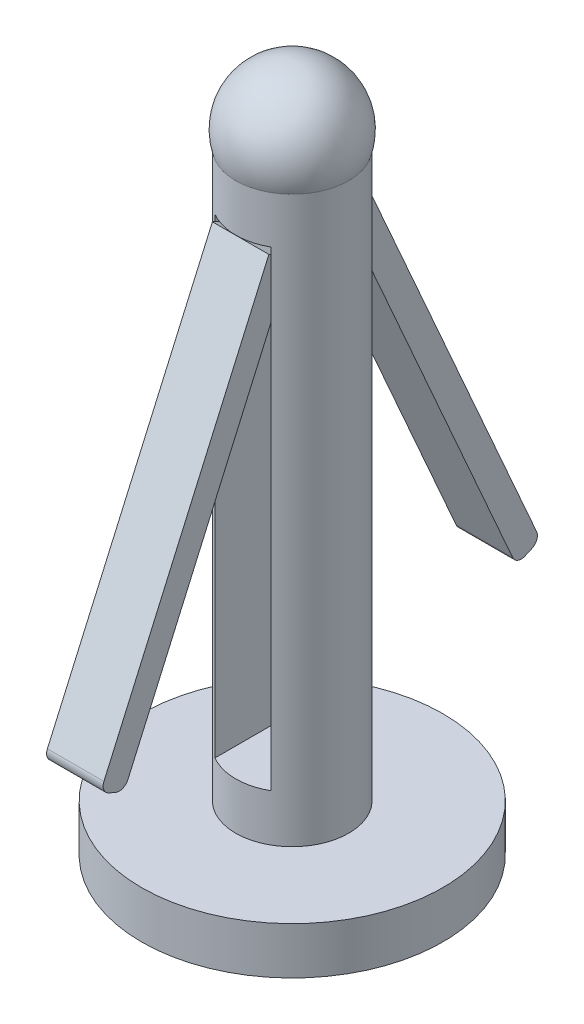
ISO-10303-21;
HEADER;
FILE_DESCRIPTION(('STEP AP214'),'2;1');
FILE_NAME('part.step','',(''),(''),'','','');
FILE_SCHEMA(('AUTOMOTIVE_DESIGN { 1 0 10303 214 1 1 1 1 }'));
ENDSEC;
DATA;
#1=APPLICATION_CONTEXT('core data for automotive mechanical design processes');
#2=APPLICATION_PROTOCOL_DEFINITION('international standard','automotive_design',2000,#1);
#3=PRODUCT_CONTEXT('',#1,'mechanical');
#4=PRODUCT('Part','Part','',(#3));
#5=PRODUCT_RELATED_PRODUCT_CATEGORY('part','',(#4));
#6=PRODUCT_DEFINITION_FORMATION('','',#4);
#7=PRODUCT_DEFINITION_CONTEXT('part definition',#1,'design');
#8=PRODUCT_DEFINITION('design','',#6,#7);
#9=PRODUCT_DEFINITION_SHAPE('','',#8);
#10=(LENGTH_UNIT() NAMED_UNIT(*) SI_UNIT(.MILLI.,.METRE.));
#11=(NAMED_UNIT(*) PLANE_ANGLE_UNIT() SI_UNIT($,.RADIAN.));
#12=(NAMED_UNIT(*) SI_UNIT($,.STERADIAN.) SOLID_ANGLE_UNIT());
#13=UNCERTAINTY_MEASURE_WITH_UNIT(LENGTH_MEASURE(1.E-05),#10,'distance_accuracy_value','');
#14=(GEOMETRIC_REPRESENTATION_CONTEXT(3) GLOBAL_UNCERTAINTY_ASSIGNED_CONTEXT((#13)) GLOBAL_UNIT_ASSIGNED_CONTEXT((#10,
#11,#12)) REPRESENTATION_CONTEXT('',''));
#15=CARTESIAN_POINT('',(0.,0.,0.));
#16=DIRECTION('',(0.,0.,1.));
#17=DIRECTION('',(1.,0.,0.));
#18=AXIS2_PLACEMENT_3D('',#15,#16,#17);
#19=CARTESIAN_POINT('',(-3.0237591290621,14.0271805623324,-21.346207791417));
#20=DIRECTION('',(1.,0.,0.));
#21=DIRECTION('',(0.,1.,0.));
#22=AXIS2_PLACEMENT_3D('',#19,#20,#21);
#23=CYLINDRICAL_SURFACE('',#22,1.);
#24=DIRECTION('',(1.,0.,0.));
#25=VECTOR('',#24,1.);
#26=CARTESIAN_POINT('',(-3.0237591290621,13.6235064220948,-20.4313049613288));
#27=LINE('',#26,#25);
#28=CARTESIAN_POINT('',(-3.0237591290621,13.6235064220948,-20.4313049613288));
#29=VERTEX_POINT('',#28);
#30=CARTESIAN_POINT('',(2.9762408709379,13.6235064220948,-20.4313049613288));
#31=VERTEX_POINT('',#30);
#32=EDGE_CURVE('E324',#29,#31,#27,.T.);
#33=ORIENTED_EDGE('',*,*,#32,.F.);
#34=CARTESIAN_POINT('',(-3.0237591290621,14.0271805623324,-21.346207791417));
#35=DIRECTION('',(1.,0.,0.));
#36=DIRECTION('',(0.,1.,0.));
#37=AXIS2_PLACEMENT_3D('',#34,#35,#36);
#38=CIRCLE('',#37,1.);
#39=CARTESIAN_POINT('',(-3.0237591290621,13.1122777322441,-21.7498819316545));
#40=VERTEX_POINT('',#39);
#41=EDGE_CURVE('E39',#40,#29,#38,.F.);
#42=ORIENTED_EDGE('',*,*,#41,.F.);
#43=DIRECTION('',(1.,0.,0.));
#44=VECTOR('',#43,1.);
#45=CARTESIAN_POINT('',(-3.0237591290621,13.1122777322441,-21.7498819316545));
#46=LINE('',#45,#44);
#47=CARTESIAN_POINT('',(2.9762408709379,13.1122777322441,-21.7498819316545));
#48=VERTEX_POINT('',#47);
#49=EDGE_CURVE('E327',#48,#40,#46,.F.);
#50=ORIENTED_EDGE('',*,*,#49,.F.);
#51=CARTESIAN_POINT('',(2.9762408709379,14.0271805623324,-21.346207791417));
#52=DIRECTION('',(1.,0.,0.));
#53=DIRECTION('',(0.,1.,0.));
#54=AXIS2_PLACEMENT_3D('',#51,#52,#53);
#55=CIRCLE('',#54,1.);
#56=EDGE_CURVE('E11',#31,#48,#55,.T.);
#57=ORIENTED_EDGE('',*,*,#56,.F.);
#58=EDGE_LOOP('',(#33,#42,#50,#57));
#59=FACE_BOUND('',#58,.T.);
#60=ADVANCED_FACE('F32',(#59),#23,.T.);
#61=CARTESIAN_POINT('',(-3.0237591290621,14.3406013358795,-22.0565568679222));
#62=DIRECTION('',(-1.,0.,0.));
#63=DIRECTION('',(0.,-1.,0.));
#64=AXIS2_PLACEMENT_3D('',#61,#62,#63);
#65=CYLINDRICAL_SURFACE('',#64,1.);
#66=DIRECTION('',(-1.,0.,0.));
#67=VECTOR('',#66,1.);
#68=CARTESIAN_POINT('',(-3.0237591290621,14.7442754761171,-22.9714596980105));
#69=LINE('',#68,#67);
#70=CARTESIAN_POINT('',(2.9762408709379,14.7442754761171,-22.9714596980105));
#71=VERTEX_POINT('',#70);
#72=CARTESIAN_POINT('',(-3.0237591290621,14.7442754761171,-22.9714596980105));
#73=VERTEX_POINT('',#72);
#74=EDGE_CURVE('E313',#71,#73,#69,.T.);
#75=ORIENTED_EDGE('',*,*,#74,.F.);
#76=CARTESIAN_POINT('',(2.9762408709379,14.3406013358795,-22.0565568679222));
#77=DIRECTION('',(1.,0.,0.));
#78=DIRECTION('',(0.,1.,0.));
#79=AXIS2_PLACEMENT_3D('',#76,#77,#78);
#80=CIRCLE('',#79,1.);
#81=CARTESIAN_POINT('',(2.9762408709379,13.4256985057913,-22.4602310081598));
#82=VERTEX_POINT('',#81);
#83=EDGE_CURVE('E319',#82,#71,#80,.T.);
#84=ORIENTED_EDGE('',*,*,#83,.F.);
#85=DIRECTION('',(-1.,0.,0.));
#86=VECTOR('',#85,1.);
#87=CARTESIAN_POINT('',(-3.0237591290621,13.4256985057913,-22.4602310081598));
#88=LINE('',#87,#86);
#89=CARTESIAN_POINT('',(-3.0237591290621,13.4256985057913,-22.4602310081598));
#90=VERTEX_POINT('',#89);
#91=EDGE_CURVE('E316',#90,#82,#88,.F.);
#92=ORIENTED_EDGE('',*,*,#91,.F.);
#93=CARTESIAN_POINT('',(-3.0237591290621,14.3406013358795,-22.0565568679222));
#94=DIRECTION('',(1.,0.,0.));
#95=DIRECTION('',(0.,1.,0.));
#96=AXIS2_PLACEMENT_3D('',#93,#94,#95);
#97=CIRCLE('',#96,1.);
#98=EDGE_CURVE('E321',#73,#90,#97,.F.);
#99=ORIENTED_EDGE('',*,*,#98,.F.);
#100=EDGE_LOOP('',(#75,#84,#92,#99));
#101=FACE_BOUND('',#100,.T.);
#102=ADVANCED_FACE('F402',(#101),#65,.T.);
#103=CARTESIAN_POINT('',(-3.0237591290621,14.0271805623324,21.346207791417));
#104=DIRECTION('',(-1.,0.,0.));
#105=DIRECTION('',(0.,-1.,0.));
#106=AXIS2_PLACEMENT_3D('',#103,#104,#105);
#107=CYLINDRICAL_SURFACE('',#106,1.);
#108=DIRECTION('',(-1.,0.,0.));
#109=VECTOR('',#108,1.);
#110=CARTESIAN_POINT('',(-3.0237591290621,13.6235064220948,20.4313049613288));
#111=LINE('',#110,#109);
#112=CARTESIAN_POINT('',(2.9762408709379,13.6235064220948,20.4313049613288));
#113=VERTEX_POINT('',#112);
#114=CARTESIAN_POINT('',(-3.0237591290621,13.6235064220948,20.4313049613288));
#115=VERTEX_POINT('',#114);
#116=EDGE_CURVE('E303',#113,#115,#111,.T.);
#117=ORIENTED_EDGE('',*,*,#116,.F.);
#118=CARTESIAN_POINT('',(2.9762408709379,14.0271805623324,21.346207791417));
#119=DIRECTION('',(1.,0.,0.));
#120=DIRECTION('',(0.,1.,0.));
#121=AXIS2_PLACEMENT_3D('',#118,#119,#120);
#122=CIRCLE('',#121,1.);
#123=CARTESIAN_POINT('',(2.9762408709379,13.1122777322441,21.7498819316545));
#124=VERTEX_POINT('',#123);
#125=EDGE_CURVE('E309',#124,#113,#122,.T.);
#126=ORIENTED_EDGE('',*,*,#125,.F.);
#127=DIRECTION('',(-1.,0.,0.));
#128=VECTOR('',#127,1.);
#129=CARTESIAN_POINT('',(-3.0237591290621,13.1122777322441,21.7498819316545));
#130=LINE('',#129,#128);
#131=CARTESIAN_POINT('',(-3.0237591290621,13.1122777322441,21.7498819316545));
#132=VERTEX_POINT('',#131);
#133=EDGE_CURVE('E306',#132,#124,#130,.F.);
#134=ORIENTED_EDGE('',*,*,#133,.F.);
#135=CARTESIAN_POINT('',(-3.0237591290621,14.0271805623324,21.346207791417));
#136=DIRECTION('',(1.,0.,0.));
#137=DIRECTION('',(0.,1.,0.));
#138=AXIS2_PLACEMENT_3D('',#135,#136,#137);
#139=CIRCLE('',#138,1.);
#140=EDGE_CURVE('E311',#115,#132,#139,.F.);
#141=ORIENTED_EDGE('',*,*,#140,.F.);
#142=EDGE_LOOP('',(#117,#126,#134,#141));
#143=FACE_BOUND('',#142,.T.);
#144=ADVANCED_FACE('F377',(#143),#107,.T.);
#145=CARTESIAN_POINT('',(-3.0237591290621,14.3406013358795,22.0565568679222));
#146=DIRECTION('',(1.,0.,0.));
#147=DIRECTION('',(0.,1.,0.));
#148=AXIS2_PLACEMENT_3D('',#145,#146,#147);
#149=CYLINDRICAL_SURFACE('',#148,1.);
#150=DIRECTION('',(1.,0.,0.));
#151=VECTOR('',#150,1.);
#152=CARTESIAN_POINT('',(-3.0237591290621,14.7442754761171,22.9714596980105));
#153=LINE('',#152,#151);
#154=CARTESIAN_POINT('',(-3.0237591290621,14.7442754761171,22.9714596980105));
#155=VERTEX_POINT('',#154);
#156=CARTESIAN_POINT('',(2.9762408709379,14.7442754761171,22.9714596980105));
#157=VERTEX_POINT('',#156);
#158=EDGE_CURVE('E292',#155,#157,#153,.T.);
#159=ORIENTED_EDGE('',*,*,#158,.F.);
#160=CARTESIAN_POINT('',(-3.0237591290621,14.3406013358795,22.0565568679222));
#161=DIRECTION('',(1.,0.,0.));
#162=DIRECTION('',(0.,1.,0.));
#163=AXIS2_PLACEMENT_3D('',#160,#161,#162);
#164=CIRCLE('',#163,1.);
#165=CARTESIAN_POINT('',(-3.0237591290621,13.4256985057913,22.4602310081598));
#166=VERTEX_POINT('',#165);
#167=EDGE_CURVE('E298',#166,#155,#164,.F.);
#168=ORIENTED_EDGE('',*,*,#167,.F.);
#169=DIRECTION('',(1.,0.,0.));
#170=VECTOR('',#169,1.);
#171=CARTESIAN_POINT('',(-3.0237591290621,13.4256985057913,22.4602310081598));
#172=LINE('',#171,#170);
#173=CARTESIAN_POINT('',(2.9762408709379,13.4256985057913,22.4602310081598));
#174=VERTEX_POINT('',#173);
#175=EDGE_CURVE('E295',#174,#166,#172,.F.);
#176=ORIENTED_EDGE('',*,*,#175,.F.);
#177=CARTESIAN_POINT('',(2.9762408709379,14.3406013358795,22.0565568679222));
#178=DIRECTION('',(1.,0.,0.));
#179=DIRECTION('',(0.,1.,0.));
#180=AXIS2_PLACEMENT_3D('',#177,#178,#179);
#181=CIRCLE('',#180,1.);
#182=EDGE_CURVE('E300',#157,#174,#181,.T.);
#183=ORIENTED_EDGE('',*,*,#182,.F.);
#184=EDGE_LOOP('',(#159,#168,#176,#183));
#185=FACE_BOUND('',#184,.T.);
#186=ADVANCED_FACE('F370',(#185),#149,.T.);
#187=CARTESIAN_POINT('',(-3.0237591290621,55.,-6.));
#188=DIRECTION('',(-1.,0.,0.));
#189=DIRECTION('',(0.,-1.,0.));
#190=AXIS2_PLACEMENT_3D('',#187,#188,#189);
#191=PLANE('',#190);
#192=DIRECTION('',(0.,-1.,0.));
#193=VECTOR('',#192,1.);
#194=CARTESIAN_POINT('',(-3.0237591290621,60.,-5.18236246603936));
#195=LINE('',#194,#193);
#196=CARTESIAN_POINT('',(-3.0237591290621,48.1843049824975,-5.18236246603936));
#197=VERTEX_POINT('',#196);
#198=CARTESIAN_POINT('',(-3.0237591290621,5.,-5.18236246603937));
#199=VERTEX_POINT('',#198);
#200=EDGE_CURVE('E194',#197,#199,#195,.T.);
#201=ORIENTED_EDGE('',*,*,#200,.F.);
#202=DIRECTION('',(0.,-0.914902830088248,-0.403674140237536));
#203=VECTOR('',#202,1.);
#204=CARTESIAN_POINT('',(-3.0237591290621,12.7086035920066,-20.8349791015663));
#205=LINE('',#204,#203);
#206=CARTESIAN_POINT('',(-3.0237591290621,53.3243296930876,-2.91447675445292));
#207=VERTEX_POINT('',#206);
#208=EDGE_CURVE('E178',#207,#197,#205,.T.);
#209=ORIENTED_EDGE('',*,*,#208,.F.);
#210=DIRECTION('',(0.,-0.403674140237535,0.914902830088249));
#211=VECTOR('',#210,1.);
#212=CARTESIAN_POINT('',(-3.0237591290621,54.4450987471099,-5.45463149113464));
#213=LINE('',#212,#211);
#214=CARTESIAN_POINT('',(-3.0237591290621,54.3249679955108,-5.18236246603936));
#215=VERTEX_POINT('',#214);
#216=EDGE_CURVE('E165',#215,#207,#213,.T.);
#217=ORIENTED_EDGE('',*,*,#216,.F.);
#218=CARTESIAN_POINT('',(-3.0237591290621,55.,-5.18236246603936));
#219=VERTEX_POINT('',#218);
#220=EDGE_CURVE('E276',#219,#215,#195,.T.);
#221=ORIENTED_EDGE('',*,*,#220,.F.);
#222=DIRECTION('',(0.,0.,1.));
#223=VECTOR('',#222,1.);
#224=CARTESIAN_POINT('',(-3.0237591290621,55.,-6.));
#225=LINE('',#224,#223);
#226=CARTESIAN_POINT('',(-3.0237591290621,55.,5.18236246603936));
#227=VERTEX_POINT('',#226);
#228=EDGE_CURVE('E242',#219,#227,#225,.T.);
#229=ORIENTED_EDGE('',*,*,#228,.T.);
#230=DIRECTION('',(0.,-1.,0.));
#231=VECTOR('',#230,1.);
#232=CARTESIAN_POINT('',(-3.0237591290621,60.,5.18236246603936));
#233=LINE('',#232,#231);
#234=CARTESIAN_POINT('',(-3.0237591290621,54.3249679955108,5.18236246603937));
#235=VERTEX_POINT('',#234);
#236=EDGE_CURVE('E270',#235,#227,#233,.F.);
#237=ORIENTED_EDGE('',*,*,#236,.F.);
#238=DIRECTION('',(0.,-0.403674140237535,-0.914902830088249));
#239=VECTOR('',#238,1.);
#240=CARTESIAN_POINT('',(-3.0237591290621,54.4450987471099,5.45463149113464));
#241=LINE('',#240,#239);
#242=CARTESIAN_POINT('',(-3.0237591290621,53.3243296930876,2.91447675445292));
#243=VERTEX_POINT('',#242);
#244=EDGE_CURVE('E219',#235,#243,#241,.T.);
#245=ORIENTED_EDGE('',*,*,#244,.T.);
#246=DIRECTION('',(0.,-0.914902830088248,0.403674140237536));
#247=VECTOR('',#246,1.);
#248=CARTESIAN_POINT('',(-3.0237591290621,12.7086035920066,20.8349791015663));
#249=LINE('',#248,#247);
#250=CARTESIAN_POINT('',(-3.0237591290621,48.1843049824975,5.18236246603936));
#251=VERTEX_POINT('',#250);
#252=EDGE_CURVE('E224',#243,#251,#249,.T.);
#253=ORIENTED_EDGE('',*,*,#252,.T.);
#254=CARTESIAN_POINT('',(-3.0237591290621,5.,5.18236246603937));
#255=VERTEX_POINT('',#254);
#256=EDGE_CURVE('E272',#255,#251,#233,.F.);
#257=ORIENTED_EDGE('',*,*,#256,.F.);
#258=DIRECTION('',(0.,0.,1.));
#259=VECTOR('',#258,1.);
#260=CARTESIAN_POINT('',(-3.0237591290621,5.,-6.));
#261=LINE('',#260,#259);
#262=EDGE_CURVE('E241',#199,#255,#261,.T.);
#263=ORIENTED_EDGE('',*,*,#262,.F.);
#264=EDGE_LOOP('',(#201,#209,#217,#221,#229,#237,#245,#253,#257,#263));
#265=FACE_BOUND('',#264,.T.);
#266=ADVANCED_FACE('F192',(#265),#191,.F.);
#267=CARTESIAN_POINT('',(2.9762408709379,55.,-6.));
#268=DIRECTION('',(1.,0.,0.));
#269=DIRECTION('',(0.,1.,0.));
#270=AXIS2_PLACEMENT_3D('',#267,#268,#269);
#271=PLANE('',#270);
#272=DIRECTION('',(0.,-0.403674140237535,0.914902830088249));
#273=VECTOR('',#272,1.);
#274=CARTESIAN_POINT('',(2.9762408709379,54.4450987471099,-5.45463149113464));
#275=LINE('',#274,#273);
#276=CARTESIAN_POINT('',(2.9762408709379,54.3370729147514,-5.2097975275589));
#277=VERTEX_POINT('',#276);
#278=CARTESIAN_POINT('',(2.9762408709379,53.3243296930876,-2.91447675445292));
#279=VERTEX_POINT('',#278);
#280=EDGE_CURVE('E207',#277,#279,#275,.T.);
#281=ORIENTED_EDGE('',*,*,#280,.T.);
#282=DIRECTION('',(0.,-0.914902830088248,-0.403674140237536));
#283=VECTOR('',#282,1.);
#284=CARTESIAN_POINT('',(2.9762408709379,12.7086035920066,-20.8349791015663));
#285=LINE('',#284,#283);
#286=CARTESIAN_POINT('',(2.9762408709379,48.1221250880581,-5.20979752755891));
#287=VERTEX_POINT('',#286);
#288=EDGE_CURVE('E186',#279,#287,#285,.T.);
#289=ORIENTED_EDGE('',*,*,#288,.T.);
#290=DIRECTION('',(0.,-1.,0.));
#291=VECTOR('',#290,1.);
#292=CARTESIAN_POINT('',(2.9762408709379,60.,-5.2097975275589));
#293=LINE('',#292,#291);
#294=CARTESIAN_POINT('',(2.9762408709379,5.,-5.2097975275589));
#295=VERTEX_POINT('',#294);
#296=EDGE_CURVE('E285',#295,#287,#293,.F.);
#297=ORIENTED_EDGE('',*,*,#296,.F.);
#298=DIRECTION('',(0.,0.,1.));
#299=VECTOR('',#298,1.);
#300=CARTESIAN_POINT('',(2.9762408709379,5.,-6.));
#301=LINE('',#300,#299);
#302=CARTESIAN_POINT('',(2.9762408709379,5.,5.2097975275589));
#303=VERTEX_POINT('',#302);
#304=EDGE_CURVE('E249',#295,#303,#301,.T.);
#305=ORIENTED_EDGE('',*,*,#304,.T.);
#306=DIRECTION('',(0.,-1.,0.));
#307=VECTOR('',#306,1.);
#308=CARTESIAN_POINT('',(2.9762408709379,60.,5.2097975275589));
#309=LINE('',#308,#307);
#310=CARTESIAN_POINT('',(2.9762408709379,48.1221250880582,5.2097975275589));
#311=VERTEX_POINT('',#310);
#312=EDGE_CURVE('E278',#311,#303,#309,.T.);
#313=ORIENTED_EDGE('',*,*,#312,.F.);
#314=DIRECTION('',(0.,-0.914902830088248,0.403674140237536));
#315=VECTOR('',#314,1.);
#316=CARTESIAN_POINT('',(2.9762408709379,12.7086035920066,20.8349791015663));
#317=LINE('',#316,#315);
#318=CARTESIAN_POINT('',(2.9762408709379,53.3243296930876,2.91447675445292));
#319=VERTEX_POINT('',#318);
#320=EDGE_CURVE('E217',#319,#311,#317,.T.);
#321=ORIENTED_EDGE('',*,*,#320,.F.);
#322=DIRECTION('',(0.,-0.403674140237536,-0.914902830088249));
#323=VECTOR('',#322,1.);
#324=CARTESIAN_POINT('',(2.9762408709379,50.3050670292558,-3.92849801300188));
#325=LINE('',#324,#323);
#326=CARTESIAN_POINT('',(2.9762408709379,54.3370729147514,5.20979752755891));
#327=VERTEX_POINT('',#326);
#328=EDGE_CURVE('E288',#327,#319,#325,.T.);
#329=ORIENTED_EDGE('',*,*,#328,.F.);
#330=CARTESIAN_POINT('',(2.9762408709379,55.,5.2097975275589));
#331=VERTEX_POINT('',#330);
#332=EDGE_CURVE('E280',#331,#327,#309,.T.);
#333=ORIENTED_EDGE('',*,*,#332,.F.);
#334=DIRECTION('',(0.,0.,1.));
#335=VECTOR('',#334,1.);
#336=CARTESIAN_POINT('',(2.9762408709379,55.,-6.));
#337=LINE('',#336,#335);
#338=CARTESIAN_POINT('',(2.9762408709379,55.,-5.2097975275589));
#339=VERTEX_POINT('',#338);
#340=EDGE_CURVE('E246',#339,#331,#337,.T.);
#341=ORIENTED_EDGE('',*,*,#340,.F.);
#342=EDGE_CURVE('E283',#277,#339,#293,.F.);
#343=ORIENTED_EDGE('',*,*,#342,.F.);
#344=EDGE_LOOP('',(#281,#289,#297,#305,#313,#321,#329,#333,#341,#343));
#345=FACE_BOUND('',#344,.T.);
#346=ADVANCED_FACE('F346',(#345),#271,.F.);
#347=CARTESIAN_POINT('',(0.,0.,0.));
#348=DIRECTION('',(0.,1.,0.));
#349=DIRECTION('',(0.,0.,1.));
#350=AXIS2_PLACEMENT_3D('',#347,#348,#349);
#351=PLANE('',#350);
#352=CARTESIAN_POINT('',(0.,0.,0.));
#353=DIRECTION('',(0.,1.,0.));
#354=DIRECTION('',(0.,0.,1.));
#355=AXIS2_PLACEMENT_3D('',#352,#353,#354);
#356=CIRCLE('',#355,16.);
#357=CARTESIAN_POINT('',(0.,0.,16.));
#358=VERTEX_POINT('',#357);
#359=EDGE_CURVE('E260',#358,#358,#356,.T.);
#360=ORIENTED_EDGE('',*,*,#359,.T.);
#361=EDGE_LOOP('',(#360));
#362=FACE_BOUND('',#361,.T.);
#363=CARTESIAN_POINT('',(0.,0.,0.));
#364=DIRECTION('',(0.,1.,0.));
#365=DIRECTION('',(0.,0.,1.));
#366=AXIS2_PLACEMENT_3D('',#363,#364,#365);
#367=CIRCLE('',#366,6.);
#368=CARTESIAN_POINT('',(0.,0.,6.));
#369=VERTEX_POINT('',#368);
#370=EDGE_CURVE('E245',#369,#369,#367,.T.);
#371=ORIENTED_EDGE('',*,*,#370,.F.);
#372=EDGE_LOOP('',(#371));
#373=FACE_BOUND('',#372,.T.);
#374=ADVANCED_FACE('F434',(#362,#373),#351,.T.);
#375=CARTESIAN_POINT('',(0.,-5.,0.));
#376=DIRECTION('',(0.,1.,0.));
#377=DIRECTION('',(0.,0.,1.));
#378=AXIS2_PLACEMENT_3D('',#375,#376,#377);
#379=CYLINDRICAL_SURFACE('',#378,16.);
#380=CARTESIAN_POINT('',(0.,-5.,0.));
#381=DIRECTION('',(0.,1.,0.));
#382=DIRECTION('',(0.,0.,1.));
#383=AXIS2_PLACEMENT_3D('',#380,#381,#382);
#384=CIRCLE('',#383,16.);
#385=CARTESIAN_POINT('',(0.,-5.,16.));
#386=VERTEX_POINT('',#385);
#387=EDGE_CURVE('E256',#386,#386,#384,.T.);
#388=ORIENTED_EDGE('',*,*,#387,.T.);
#389=EDGE_LOOP('',(#388));
#390=FACE_BOUND('',#389,.T.);
#391=ORIENTED_EDGE('',*,*,#359,.F.);
#392=EDGE_LOOP('',(#391));
#393=FACE_BOUND('',#392,.T.);
#394=ADVANCED_FACE('F430',(#390,#393),#379,.T.);
#395=CARTESIAN_POINT('',(0.,-5.,0.));
#396=DIRECTION('',(0.,1.,0.));
#397=DIRECTION('',(0.,0.,1.));
#398=AXIS2_PLACEMENT_3D('',#395,#396,#397);
#399=PLANE('',#398);
#400=ORIENTED_EDGE('',*,*,#387,.F.);
#401=EDGE_LOOP('',(#400));
#402=FACE_BOUND('',#401,.T.);
#403=ADVANCED_FACE('F433',(#402),#399,.F.);
#404=CARTESIAN_POINT('',(0.,60.,0.));
#405=DIRECTION('',(0.,-1.,0.));
#406=DIRECTION('',(0.,0.,-1.));
#407=AXIS2_PLACEMENT_3D('',#404,#405,#406);
#408=CYLINDRICAL_SURFACE('',#407,6.);
#409=ORIENTED_EDGE('',*,*,#296,.T.);
#410=EDGE_CURVE('E289',#287,#277,#293,.F.);
#411=ORIENTED_EDGE('',*,*,#410,.T.);
#412=ORIENTED_EDGE('',*,*,#342,.T.);
#413=CARTESIAN_POINT('',(0.,55.,0.));
#414=DIRECTION('',(0.,1.,0.));
#415=DIRECTION('',(0.,0.,1.));
#416=AXIS2_PLACEMENT_3D('',#413,#414,#415);
#417=CIRCLE('',#416,6.);
#418=EDGE_CURVE('E271',#339,#219,#417,.T.);
#419=ORIENTED_EDGE('',*,*,#418,.T.);
#420=ORIENTED_EDGE('',*,*,#220,.T.);
#421=EDGE_CURVE('E279',#215,#197,#195,.T.);
#422=ORIENTED_EDGE('',*,*,#421,.T.);
#423=ORIENTED_EDGE('',*,*,#200,.T.);
#424=CARTESIAN_POINT('',(0.,5.,0.));
#425=DIRECTION('',(0.,-1.,0.));
#426=DIRECTION('',(0.,0.,-1.));
#427=AXIS2_PLACEMENT_3D('',#424,#425,#426);
#428=CIRCLE('',#427,6.);
#429=EDGE_CURVE('E268',#199,#295,#428,.T.);
#430=ORIENTED_EDGE('',*,*,#429,.T.);
#431=EDGE_LOOP('',(#409,#411,#412,#419,#420,#422,#423,#430));
#432=FACE_BOUND('',#431,.T.);
#433=EDGE_CURVE('E267',#227,#331,#417,.T.);
#434=ORIENTED_EDGE('',*,*,#433,.T.);
#435=ORIENTED_EDGE('',*,*,#332,.T.);
#436=EDGE_CURVE('E284',#327,#311,#309,.T.);
#437=ORIENTED_EDGE('',*,*,#436,.T.);
#438=ORIENTED_EDGE('',*,*,#312,.T.);
#439=EDGE_CURVE('E259',#303,#255,#428,.T.);
#440=ORIENTED_EDGE('',*,*,#439,.T.);
#441=ORIENTED_EDGE('',*,*,#256,.T.);
#442=EDGE_CURVE('E275',#251,#235,#233,.F.);
#443=ORIENTED_EDGE('',*,*,#442,.T.);
#444=ORIENTED_EDGE('',*,*,#236,.T.);
#445=EDGE_LOOP('',(#434,#435,#437,#438,#440,#441,#443,#444));
#446=FACE_BOUND('',#445,.T.);
#447=CARTESIAN_POINT('',(0.,60.,0.));
#448=DIRECTION('',(0.,1.,0.));
#449=DIRECTION('',(0.,0.,1.));
#450=AXIS2_PLACEMENT_3D('',#447,#448,#449);
#451=CIRCLE('',#450,6.);
#452=CARTESIAN_POINT('',(0.,60.,6.));
#453=VERTEX_POINT('',#452);
#454=EDGE_CURVE('E255',#453,#453,#451,.T.);
#455=ORIENTED_EDGE('',*,*,#454,.F.);
#456=EDGE_LOOP('',(#455));
#457=FACE_BOUND('',#456,.T.);
#458=ORIENTED_EDGE('',*,*,#370,.T.);
#459=EDGE_LOOP('',(#458));
#460=FACE_BOUND('',#459,.T.);
#461=ADVANCED_FACE('F337',(#432,#446,#457,#460),#408,.T.);
#462=CARTESIAN_POINT('',(0.,61.75,0.));
#463=DIRECTION('',(0.,0.,1.));
#464=DIRECTION('',(1.,0.,0.));
#465=AXIS2_PLACEMENT_3D('',#462,#463,#464);
#466=SPHERICAL_SURFACE('',#465,6.25);
#467=CARTESIAN_POINT('',(0.,61.75,0.));
#468=DIRECTION('',(0.,1.,0.));
#469=DIRECTION('',(0.,0.,1.));
#470=AXIS2_PLACEMENT_3D('',#467,#468,#469);
#471=SPHERICAL_SURFACE('',#470,6.25);
#472=ORIENTED_EDGE('',*,*,#454,.T.);
#473=EDGE_LOOP('',(#472));
#474=FACE_BOUND('',#473,.T.);
#475=ADVANCED_FACE('F426',(#474),#471,.T.);
#476=CARTESIAN_POINT('',(2.9762408709379,55.,-6.));
#477=DIRECTION('',(0.,1.,0.));
#478=DIRECTION('',(0.,0.,1.));
#479=AXIS2_PLACEMENT_3D('',#476,#477,#478);
#480=PLANE('',#479);
#481=ORIENTED_EDGE('',*,*,#340,.T.);
#482=ORIENTED_EDGE('',*,*,#433,.F.);
#483=ORIENTED_EDGE('',*,*,#228,.F.);
#484=ORIENTED_EDGE('',*,*,#418,.F.);
#485=EDGE_LOOP('',(#481,#482,#483,#484));
#486=FACE_BOUND('',#485,.T.);
#487=ADVANCED_FACE('F343',(#486),#480,.F.);
#488=CARTESIAN_POINT('',(2.9762408709379,5.,-6.));
#489=DIRECTION('',(0.,-1.,0.));
#490=DIRECTION('',(0.,0.,-1.));
#491=AXIS2_PLACEMENT_3D('',#488,#489,#490);
#492=PLANE('',#491);
#493=ORIENTED_EDGE('',*,*,#304,.F.);
#494=ORIENTED_EDGE('',*,*,#429,.F.);
#495=ORIENTED_EDGE('',*,*,#262,.T.);
#496=ORIENTED_EDGE('',*,*,#439,.F.);
#497=EDGE_LOOP('',(#493,#494,#495,#496));
#498=FACE_BOUND('',#497,.T.);
#499=ADVANCED_FACE('F387',(#498),#492,.F.);
#500=CARTESIAN_POINT('',(-3.0237591290621,0.,0.));
#501=DIRECTION('',(1.,0.,0.));
#502=DIRECTION('',(0.,1.,0.));
#503=AXIS2_PLACEMENT_3D('',#500,#501,#502);
#504=PLANE('',#503);
#505=EDGE_CURVE('E223',#251,#115,#249,.T.);
#506=ORIENTED_EDGE('',*,*,#505,.T.);
#507=ORIENTED_EDGE('',*,*,#140,.T.);
#508=DIRECTION('',(0.,0.403674140237536,0.914902830088248));
#509=VECTOR('',#508,1.);
#510=CARTESIAN_POINT('',(-3.0237591290621,13.8293726460288,23.375133838248));
#511=LINE('',#510,#509);
#512=EDGE_CURVE('E214',#132,#166,#511,.T.);
#513=ORIENTED_EDGE('',*,*,#512,.T.);
#514=ORIENTED_EDGE('',*,*,#167,.T.);
#515=DIRECTION('',(0.,0.914902830088248,-0.403674140237536));
#516=VECTOR('',#515,1.);
#517=CARTESIAN_POINT('',(-3.0237591290621,54.4450987471099,5.45463149113464));
#518=LINE('',#517,#516);
#519=CARTESIAN_POINT('',(-3.0237591290621,54.4450987471099,5.45463149113464));
#520=VERTEX_POINT('',#519);
#521=EDGE_CURVE('E216',#155,#520,#518,.T.);
#522=ORIENTED_EDGE('',*,*,#521,.T.);
#523=EDGE_CURVE('E220',#520,#235,#241,.T.);
#524=ORIENTED_EDGE('',*,*,#523,.T.);
#525=ORIENTED_EDGE('',*,*,#442,.F.);
#526=EDGE_LOOP('',(#506,#507,#513,#514,#522,#524,#525));
#527=FACE_BOUND('',#526,.T.);
#528=ADVANCED_FACE('F393',(#527),#504,.F.);
#529=CARTESIAN_POINT('',(2.9762408709379,0.,0.));
#530=DIRECTION('',(1.,0.,0.));
#531=DIRECTION('',(0.,1.,0.));
#532=AXIS2_PLACEMENT_3D('',#529,#530,#531);
#533=PLANE('',#532);
#534=DIRECTION('',(0.,0.403674140237536,0.914902830088248));
#535=VECTOR('',#534,1.);
#536=CARTESIAN_POINT('',(2.9762408709379,13.8293726460288,23.375133838248));
#537=LINE('',#536,#535);
#538=EDGE_CURVE('E188',#124,#174,#537,.T.);
#539=ORIENTED_EDGE('',*,*,#538,.F.);
#540=ORIENTED_EDGE('',*,*,#125,.T.);
#541=EDGE_CURVE('E233',#311,#113,#317,.T.);
#542=ORIENTED_EDGE('',*,*,#541,.F.);
#543=ORIENTED_EDGE('',*,*,#436,.F.);
#544=DIRECTION('',(0.,-0.403674140237535,-0.914902830088249));
#545=VECTOR('',#544,1.);
#546=CARTESIAN_POINT('',(2.9762408709379,54.4450987471099,5.45463149113464));
#547=LINE('',#546,#545);
#548=CARTESIAN_POINT('',(2.9762408709379,54.4450987471099,5.45463149113464));
#549=VERTEX_POINT('',#548);
#550=EDGE_CURVE('E230',#549,#327,#547,.T.);
#551=ORIENTED_EDGE('',*,*,#550,.F.);
#552=DIRECTION('',(0.,0.914902830088248,-0.403674140237536));
#553=VECTOR('',#552,1.);
#554=CARTESIAN_POINT('',(2.9762408709379,54.4450987471099,5.45463149113464));
#555=LINE('',#554,#553);
#556=EDGE_CURVE('E228',#157,#549,#555,.T.);
#557=ORIENTED_EDGE('',*,*,#556,.F.);
#558=ORIENTED_EDGE('',*,*,#182,.T.);
#559=EDGE_LOOP('',(#539,#540,#542,#543,#551,#557,#558));
#560=FACE_BOUND('',#559,.T.);
#561=ADVANCED_FACE('F354',(#560),#533,.T.);
#562=CARTESIAN_POINT('',(-3.0237591290621,13.8293726460288,23.375133838248));
#563=DIRECTION('',(0.,0.914902830088248,-0.403674140237536));
#564=DIRECTION('',(0.,0.403674140237536,0.914902830088248));
#565=AXIS2_PLACEMENT_3D('',#562,#563,#564);
#566=PLANE('',#565);
#567=ORIENTED_EDGE('',*,*,#512,.F.);
#568=ORIENTED_EDGE('',*,*,#133,.T.);
#569=ORIENTED_EDGE('',*,*,#538,.T.);
#570=ORIENTED_EDGE('',*,*,#175,.T.);
#571=EDGE_LOOP('',(#567,#568,#569,#570));
#572=FACE_BOUND('',#571,.T.);
#573=ADVANCED_FACE('F373',(#572),#566,.F.);
#574=CARTESIAN_POINT('',(-3.0237591290621,54.4450987471099,5.45463149113464));
#575=DIRECTION('',(0.,-0.403674140237536,-0.914902830088248));
#576=DIRECTION('',(0.,0.914902830088248,-0.403674140237536));
#577=AXIS2_PLACEMENT_3D('',#574,#575,#576);
#578=PLANE('',#577);
#579=ORIENTED_EDGE('',*,*,#521,.F.);
#580=ORIENTED_EDGE('',*,*,#158,.T.);
#581=ORIENTED_EDGE('',*,*,#556,.T.);
#582=DIRECTION('',(1.,0.,0.));
#583=VECTOR('',#582,1.);
#584=CARTESIAN_POINT('',(-3.0237591290621,54.4450987471099,5.45463149113464));
#585=LINE('',#584,#583);
#586=EDGE_CURVE('E238',#520,#549,#585,.T.);
#587=ORIENTED_EDGE('',*,*,#586,.F.);
#588=EDGE_LOOP('',(#579,#580,#581,#587));
#589=FACE_BOUND('',#588,.T.);
#590=ADVANCED_FACE('F365',(#589),#578,.F.);
#591=CARTESIAN_POINT('',(-3.0237591290621,54.4450987471099,5.45463149113464));
#592=DIRECTION('',(0.,-0.914902830088248,0.403674140237535));
#593=DIRECTION('',(0.,-0.403674140237536,-0.914902830088249));
#594=AXIS2_PLACEMENT_3D('',#591,#592,#593);
#595=PLANE('',#594);
#596=ORIENTED_EDGE('',*,*,#550,.T.);
#597=ORIENTED_EDGE('',*,*,#328,.T.);
#598=DIRECTION('',(1.,0.,0.));
#599=VECTOR('',#598,1.);
#600=CARTESIAN_POINT('',(-3.0237591290621,53.3243296930876,2.91447675445292));
#601=LINE('',#600,#599);
#602=EDGE_CURVE('E226',#243,#319,#601,.T.);
#603=ORIENTED_EDGE('',*,*,#602,.F.);
#604=ORIENTED_EDGE('',*,*,#244,.F.);
#605=ORIENTED_EDGE('',*,*,#523,.F.);
#606=ORIENTED_EDGE('',*,*,#586,.T.);
#607=EDGE_LOOP('',(#596,#597,#603,#604,#605,#606));
#608=FACE_BOUND('',#607,.T.);
#609=ADVANCED_FACE('F358',(#608),#595,.F.);
#610=CARTESIAN_POINT('',(-3.0237591290621,12.7086035920066,20.8349791015663));
#611=DIRECTION('',(0.,0.403674140237536,0.914902830088248));
#612=DIRECTION('',(0.,-0.914902830088248,0.403674140237536));
#613=AXIS2_PLACEMENT_3D('',#610,#611,#612);
#614=PLANE('',#613);
#615=ORIENTED_EDGE('',*,*,#541,.T.);
#616=ORIENTED_EDGE('',*,*,#116,.T.);
#617=ORIENTED_EDGE('',*,*,#505,.F.);
#618=ORIENTED_EDGE('',*,*,#252,.F.);
#619=ORIENTED_EDGE('',*,*,#602,.T.);
#620=ORIENTED_EDGE('',*,*,#320,.T.);
#621=EDGE_LOOP('',(#615,#616,#617,#618,#619,#620));
#622=FACE_BOUND('',#621,.T.);
#623=ADVANCED_FACE('F381',(#622),#614,.F.);
#624=CARTESIAN_POINT('',(-3.0237591290621,0.,0.));
#625=DIRECTION('',(1.,0.,0.));
#626=DIRECTION('',(0.,1.,0.));
#627=AXIS2_PLACEMENT_3D('',#624,#625,#626);
#628=PLANE('',#627);
#629=DIRECTION('',(0.,0.403674140237536,-0.914902830088248));
#630=VECTOR('',#629,1.);
#631=CARTESIAN_POINT('',(-3.0237591290621,13.8293726460288,-23.375133838248));
#632=LINE('',#631,#630);
#633=EDGE_CURVE('E198',#40,#90,#632,.T.);
#634=ORIENTED_EDGE('',*,*,#633,.F.);
#635=ORIENTED_EDGE('',*,*,#41,.T.);
#636=EDGE_CURVE('E196',#197,#29,#205,.T.);
#637=ORIENTED_EDGE('',*,*,#636,.F.);
#638=ORIENTED_EDGE('',*,*,#421,.F.);
#639=CARTESIAN_POINT('',(-3.0237591290621,54.4450987471099,-5.45463149113464));
#640=VERTEX_POINT('',#639);
#641=EDGE_CURVE('E174',#640,#215,#213,.T.);
#642=ORIENTED_EDGE('',*,*,#641,.F.);
#643=DIRECTION('',(0.,0.914902830088248,0.403674140237536));
#644=VECTOR('',#643,1.);
#645=CARTESIAN_POINT('',(-3.0237591290621,54.4450987471099,-5.45463149113464));
#646=LINE('',#645,#644);
#647=EDGE_CURVE('E201',#73,#640,#646,.T.);
#648=ORIENTED_EDGE('',*,*,#647,.F.);
#649=ORIENTED_EDGE('',*,*,#98,.T.);
#650=EDGE_LOOP('',(#634,#635,#637,#638,#642,#648,#649));
#651=FACE_BOUND('',#650,.T.);
#652=ADVANCED_FACE('F330',(#651),#628,.F.);
#653=CARTESIAN_POINT('',(2.9762408709379,0.,0.));
#654=DIRECTION('',(1.,0.,0.));
#655=DIRECTION('',(0.,1.,0.));
#656=AXIS2_PLACEMENT_3D('',#653,#654,#655);
#657=PLANE('',#656);
#658=EDGE_CURVE('E205',#287,#31,#285,.T.);
#659=ORIENTED_EDGE('',*,*,#658,.T.);
#660=ORIENTED_EDGE('',*,*,#56,.T.);
#661=DIRECTION('',(0.,0.403674140237536,-0.914902830088248));
#662=VECTOR('',#661,1.);
#663=CARTESIAN_POINT('',(2.9762408709379,13.8293726460288,-23.375133838248));
#664=LINE('',#663,#662);
#665=EDGE_CURVE('E203',#48,#82,#664,.T.);
#666=ORIENTED_EDGE('',*,*,#665,.T.);
#667=ORIENTED_EDGE('',*,*,#83,.T.);
#668=DIRECTION('',(0.,0.914902830088248,0.403674140237536));
#669=VECTOR('',#668,1.);
#670=CARTESIAN_POINT('',(2.9762408709379,54.4450987471099,-5.45463149113464));
#671=LINE('',#670,#669);
#672=CARTESIAN_POINT('',(2.9762408709379,54.4450987471099,-5.45463149113464));
#673=VERTEX_POINT('',#672);
#674=EDGE_CURVE('E210',#71,#673,#671,.T.);
#675=ORIENTED_EDGE('',*,*,#674,.T.);
#676=EDGE_CURVE('E208',#673,#277,#275,.T.);
#677=ORIENTED_EDGE('',*,*,#676,.T.);
#678=ORIENTED_EDGE('',*,*,#410,.F.);
#679=EDGE_LOOP('',(#659,#660,#666,#667,#675,#677,#678));
#680=FACE_BOUND('',#679,.T.);
#681=ADVANCED_FACE('F331',(#680),#657,.T.);
#682=CARTESIAN_POINT('',(-3.0237591290621,13.8293726460288,-23.375133838248));
#683=DIRECTION('',(0.,-0.914902830088248,-0.403674140237536));
#684=DIRECTION('',(0.,0.403674140237536,-0.914902830088248));
#685=AXIS2_PLACEMENT_3D('',#682,#683,#684);
#686=PLANE('',#685);
#687=ORIENTED_EDGE('',*,*,#665,.F.);
#688=ORIENTED_EDGE('',*,*,#49,.T.);
#689=ORIENTED_EDGE('',*,*,#633,.T.);
#690=ORIENTED_EDGE('',*,*,#91,.T.);
#691=EDGE_LOOP('',(#687,#688,#689,#690));
#692=FACE_BOUND('',#691,.T.);
#693=ADVANCED_FACE('F405',(#692),#686,.T.);
#694=CARTESIAN_POINT('',(-3.0237591290621,12.7086035920066,-20.8349791015663));
#695=DIRECTION('',(0.,-0.403674140237536,0.914902830088248));
#696=DIRECTION('',(0.,-0.914902830088248,-0.403674140237536));
#697=AXIS2_PLACEMENT_3D('',#694,#695,#696);
#698=PLANE('',#697);
#699=ORIENTED_EDGE('',*,*,#636,.T.);
#700=ORIENTED_EDGE('',*,*,#32,.T.);
#701=ORIENTED_EDGE('',*,*,#658,.F.);
#702=ORIENTED_EDGE('',*,*,#288,.F.);
#703=DIRECTION('',(1.,0.,0.));
#704=VECTOR('',#703,1.);
#705=CARTESIAN_POINT('',(-3.0237591290621,53.3243296930876,-2.91447675445292));
#706=LINE('',#705,#704);
#707=EDGE_CURVE('E170',#207,#279,#706,.T.);
#708=ORIENTED_EDGE('',*,*,#707,.F.);
#709=ORIENTED_EDGE('',*,*,#208,.T.);
#710=EDGE_LOOP('',(#699,#700,#701,#702,#708,#709));
#711=FACE_BOUND('',#710,.T.);
#712=ADVANCED_FACE('F182',(#711),#698,.T.);
#713=CARTESIAN_POINT('',(-3.0237591290621,54.4450987471099,-5.45463149113464));
#714=DIRECTION('',(0.,0.914902830088248,0.403674140237535));
#715=DIRECTION('',(0.,-0.403674140237536,0.914902830088249));
#716=AXIS2_PLACEMENT_3D('',#713,#714,#715);
#717=PLANE('',#716);
#718=ORIENTED_EDGE('',*,*,#676,.F.);
#719=DIRECTION('',(1.,0.,0.));
#720=VECTOR('',#719,1.);
#721=CARTESIAN_POINT('',(-3.0237591290621,54.4450987471099,-5.45463149113464));
#722=LINE('',#721,#720);
#723=EDGE_CURVE('E189',#640,#673,#722,.T.);
#724=ORIENTED_EDGE('',*,*,#723,.F.);
#725=ORIENTED_EDGE('',*,*,#641,.T.);
#726=ORIENTED_EDGE('',*,*,#216,.T.);
#727=ORIENTED_EDGE('',*,*,#707,.T.);
#728=ORIENTED_EDGE('',*,*,#280,.F.);
#729=EDGE_LOOP('',(#718,#724,#725,#726,#727,#728));
#730=FACE_BOUND('',#729,.T.);
#731=ADVANCED_FACE('F168',(#730),#717,.T.);
#732=CARTESIAN_POINT('',(-3.0237591290621,54.4450987471099,-5.45463149113464));
#733=DIRECTION('',(0.,0.403674140237536,-0.914902830088248));
#734=DIRECTION('',(0.,0.914902830088248,0.403674140237536));
#735=AXIS2_PLACEMENT_3D('',#732,#733,#734);
#736=PLANE('',#735);
#737=ORIENTED_EDGE('',*,*,#674,.F.);
#738=ORIENTED_EDGE('',*,*,#74,.T.);
#739=ORIENTED_EDGE('',*,*,#647,.T.);
#740=ORIENTED_EDGE('',*,*,#723,.T.);
#741=EDGE_LOOP('',(#737,#738,#739,#740));
#742=FACE_BOUND('',#741,.T.);
#743=ADVANCED_FACE('F398',(#742),#736,.T.);
#744=CLOSED_SHELL('',(#60,#102,#144,#186,#266,#346,#374,#394,#403,#461,#475,#487,#499,#528,#561,
#573,#590,#609,#623,#652,#681,#693,#712,#731,#743));
#745=MANIFOLD_SOLID_BREP('B2',#744);
#746=ADVANCED_BREP_SHAPE_REPRESENTATION('',(#18,#745),#14);
#747=SHAPE_DEFINITION_REPRESENTATION(#9,#746);
ENDSEC;
END-ISO-10303-21;
